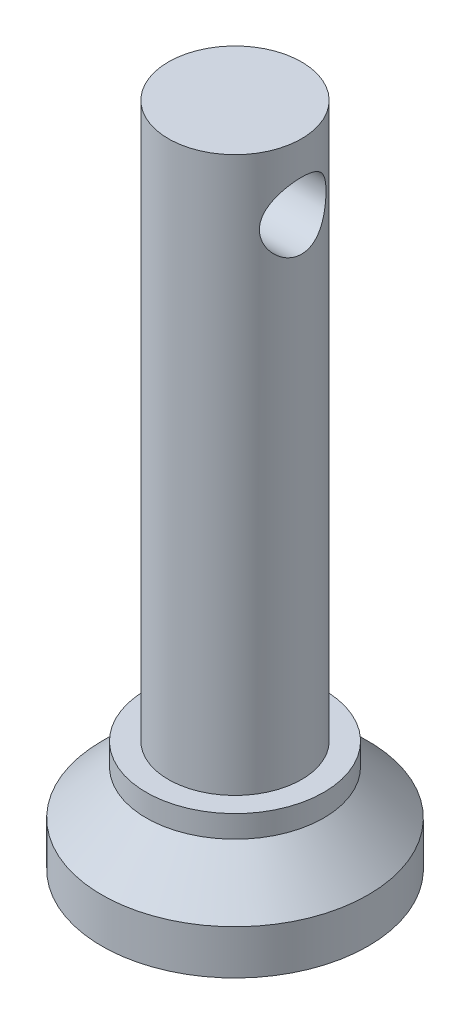
ISO-10303-21;
HEADER;
FILE_DESCRIPTION(('STEP AP214'),'2;1');
FILE_NAME('part.step','',(''),(''),'','','');
FILE_SCHEMA(('AUTOMOTIVE_DESIGN { 1 0 10303 214 1 1 1 1 }'));
ENDSEC;
DATA;
#1=APPLICATION_CONTEXT('core data for automotive mechanical design processes');
#2=APPLICATION_PROTOCOL_DEFINITION('international standard','automotive_design',2000,#1);
#3=PRODUCT_CONTEXT('',#1,'mechanical');
#4=PRODUCT('Part','Part','',(#3));
#5=PRODUCT_RELATED_PRODUCT_CATEGORY('part','',(#4));
#6=PRODUCT_DEFINITION_FORMATION('','',#4);
#7=PRODUCT_DEFINITION_CONTEXT('part definition',#1,'design');
#8=PRODUCT_DEFINITION('design','',#6,#7);
#9=PRODUCT_DEFINITION_SHAPE('','',#8);
#10=(LENGTH_UNIT() NAMED_UNIT(*) SI_UNIT(.MILLI.,.METRE.));
#11=(NAMED_UNIT(*) PLANE_ANGLE_UNIT() SI_UNIT($,.RADIAN.));
#12=(NAMED_UNIT(*) SI_UNIT($,.STERADIAN.) SOLID_ANGLE_UNIT());
#13=UNCERTAINTY_MEASURE_WITH_UNIT(LENGTH_MEASURE(1.E-05),#10,'distance_accuracy_value','');
#14=(GEOMETRIC_REPRESENTATION_CONTEXT(3) GLOBAL_UNCERTAINTY_ASSIGNED_CONTEXT((#13)) GLOBAL_UNIT_ASSIGNED_CONTEXT((#10,
#11,#12)) REPRESENTATION_CONTEXT('',''));
#15=CARTESIAN_POINT('',(0.,0.,0.));
#16=DIRECTION('',(0.,0.,1.));
#17=DIRECTION('',(1.,0.,0.));
#18=AXIS2_PLACEMENT_3D('',#15,#16,#17);
#19=CARTESIAN_POINT('',(0.,30.,0.));
#20=DIRECTION('',(0.,1.,0.));
#21=DIRECTION('',(-1.,0.,0.));
#22=AXIS2_PLACEMENT_3D('',#19,#20,#21);
#23=CYLINDRICAL_SURFACE('',#22,6.);
#24=CARTESIAN_POINT('',(0.,0.,0.));
#25=DIRECTION('',(0.,1.,0.));
#26=DIRECTION('',(-1.,0.,0.));
#27=AXIS2_PLACEMENT_3D('',#24,#25,#26);
#28=CIRCLE('',#27,6.);
#29=CARTESIAN_POINT('',(-5.99999999999997,0.,0.));
#30=VERTEX_POINT('',#29);
#31=EDGE_CURVE('E85',#30,#30,#28,.T.);
#32=ORIENTED_EDGE('',*,*,#31,.T.);
#33=EDGE_LOOP('',(#32));
#34=FACE_BOUND('',#33,.T.);
#35=CARTESIAN_POINT('',(0.,2.,0.));
#36=DIRECTION('',(0.,1.,0.));
#37=DIRECTION('',(-1.,0.,0.));
#38=AXIS2_PLACEMENT_3D('',#35,#36,#37);
#39=CIRCLE('',#38,6.);
#40=CARTESIAN_POINT('',(-5.99999999999997,2.,0.));
#41=VERTEX_POINT('',#40);
#42=EDGE_CURVE('E10',#41,#41,#39,.T.);
#43=ORIENTED_EDGE('',*,*,#42,.F.);
#44=EDGE_LOOP('',(#43));
#45=FACE_BOUND('',#44,.T.);
#46=ADVANCED_FACE('F30',(#34,#45),#23,.T.);
#47=CARTESIAN_POINT('',(0.,4.,0.));
#48=DIRECTION('',(0.,-1.,0.));
#49=DIRECTION('',(1.,0.,0.));
#50=AXIS2_PLACEMENT_3D('',#47,#48,#49);
#51=CONICAL_SURFACE('',#50,3.99999999999999,0.785398163397453);
#52=ORIENTED_EDGE('',*,*,#42,.T.);
#53=EDGE_LOOP('',(#52));
#54=FACE_BOUND('',#53,.T.);
#55=CARTESIAN_POINT('',(0.,4.,0.));
#56=DIRECTION('',(0.,1.,0.));
#57=DIRECTION('',(-1.,0.,0.));
#58=AXIS2_PLACEMENT_3D('',#55,#56,#57);
#59=CIRCLE('',#58,3.99999999999999);
#60=CARTESIAN_POINT('',(-3.99999999999996,4.,0.));
#61=VERTEX_POINT('',#60);
#62=EDGE_CURVE('E41',#61,#61,#59,.T.);
#63=ORIENTED_EDGE('',*,*,#62,.F.);
#64=EDGE_LOOP('',(#63));
#65=FACE_BOUND('',#64,.T.);
#66=ADVANCED_FACE('F76',(#54,#65),#51,.T.);
#67=CARTESIAN_POINT('',(0.,30.,0.));
#68=DIRECTION('',(0.,1.,0.));
#69=DIRECTION('',(-1.,0.,0.));
#70=AXIS2_PLACEMENT_3D('',#67,#68,#69);
#71=CYLINDRICAL_SURFACE('',#70,3.99999999999999);
#72=ORIENTED_EDGE('',*,*,#62,.T.);
#73=EDGE_LOOP('',(#72));
#74=FACE_BOUND('',#73,.T.);
#75=CARTESIAN_POINT('',(0.,5.,0.));
#76=DIRECTION('',(0.,1.,0.));
#77=DIRECTION('',(-1.,0.,0.));
#78=AXIS2_PLACEMENT_3D('',#75,#76,#77);
#79=CIRCLE('',#78,4.);
#80=CARTESIAN_POINT('',(-3.99999999999997,5.,0.));
#81=VERTEX_POINT('',#80);
#82=EDGE_CURVE('E46',#81,#81,#79,.T.);
#83=ORIENTED_EDGE('',*,*,#82,.F.);
#84=EDGE_LOOP('',(#83));
#85=FACE_BOUND('',#84,.T.);
#86=ADVANCED_FACE('F81',(#74,#85),#71,.T.);
#87=CARTESIAN_POINT('',(-3.99999999999998,5.,0.));
#88=DIRECTION('',(0.,1.,0.));
#89=DIRECTION('',(-1.,0.,0.));
#90=AXIS2_PLACEMENT_3D('',#87,#88,#89);
#91=PLANE('',#90);
#92=ORIENTED_EDGE('',*,*,#82,.T.);
#93=EDGE_LOOP('',(#92));
#94=FACE_BOUND('',#93,.T.);
#95=CARTESIAN_POINT('',(0.,5.,0.));
#96=DIRECTION('',(0.,1.,0.));
#97=DIRECTION('',(-1.,0.,0.));
#98=AXIS2_PLACEMENT_3D('',#95,#96,#97);
#99=CIRCLE('',#98,3.);
#100=CARTESIAN_POINT('',(-2.99999999999997,5.,0.));
#101=VERTEX_POINT('',#100);
#102=EDGE_CURVE('E88',#101,#101,#99,.T.);
#103=ORIENTED_EDGE('',*,*,#102,.F.);
#104=EDGE_LOOP('',(#103));
#105=FACE_BOUND('',#104,.T.);
#106=ADVANCED_FACE('F72',(#94,#105),#91,.T.);
#107=CARTESIAN_POINT('',(0.,30.,0.));
#108=DIRECTION('',(0.,1.,0.));
#109=DIRECTION('',(-1.,0.,0.));
#110=AXIS2_PLACEMENT_3D('',#107,#108,#109);
#111=CYLINDRICAL_SURFACE('',#110,3.);
#112=CARTESIAN_POINT('',(-3.00000000000003,25.5,0.));
#113=CARTESIAN_POINT('',(-2.99999570107569,25.5000049534757,0.0788579444267678));
#114=CARTESIAN_POINT('',(-2.99685736529634,25.5062551096816,0.15780989954625));
#115=CARTESIAN_POINT('',(-2.9846123405573,25.5309793205123,0.313380352903241));
#116=CARTESIAN_POINT('',(-2.97549431743376,25.5494765894967,0.389994130070342));
#117=CARTESIAN_POINT('',(-2.9522441910506,25.597790712925,0.53840031732058));
#118=CARTESIAN_POINT('',(-2.93813158766302,25.627563576372,0.610210204408634));
#119=CARTESIAN_POINT('',(-2.90618664773639,25.6973559320475,0.747708925209846));
#120=CARTESIAN_POINT('',(-2.88835460450288,25.7373746163733,0.813398240985063));
#121=CARTESIAN_POINT('',(-2.84934387387096,25.8292758742279,0.941261726642838));
#122=CARTESIAN_POINT('',(-2.82802798691308,25.8817297188594,1.00298281668311));
#123=CARTESIAN_POINT('',(-2.78489955370109,25.9957822188705,1.11716916730027));
#124=CARTESIAN_POINT('',(-2.76308664313538,26.0573877776587,1.16962737465982));
#125=CARTESIAN_POINT('',(-2.71948426796007,26.1937250242851,1.26787800067511));
#126=CARTESIAN_POINT('',(-2.69782780455192,26.2691041475188,1.31283800332731));
#127=CARTESIAN_POINT('',(-2.65928968158482,26.4275510039793,1.38925234033597));
#128=CARTESIAN_POINT('',(-2.64240461410485,26.5106131930841,1.42071632244935));
#129=CARTESIAN_POINT('',(-2.6168680055671,26.6769976581329,1.46719866328271));
#130=CARTESIAN_POINT('',(-2.60778407375565,26.7600066781011,1.48308878562056));
#131=CARTESIAN_POINT('',(-2.59772834922789,26.9279682566692,1.50064048996323));
#132=CARTESIAN_POINT('',(-2.59674854014935,27.0129188113067,1.50231613255956));
#133=CARTESIAN_POINT('',(-2.60266395385876,27.171429036473,1.4920309307584));
#134=CARTESIAN_POINT('',(-2.6086314549302,27.2451360468346,1.48167683930521));
#135=CARTESIAN_POINT('',(-2.62614343100766,27.3895828640596,1.4504097735853));
#136=CARTESIAN_POINT('',(-2.6376896824765,27.460321717958,1.42949343584629));
#137=CARTESIAN_POINT('',(-2.665312146191,27.5988436988485,1.37731467057883));
#138=CARTESIAN_POINT('',(-2.68148760995994,27.6665195981788,1.34582260067393));
#139=CARTESIAN_POINT('',(-2.71655106422103,27.7959514388851,1.27356253150189));
#140=CARTESIAN_POINT('',(-2.73544027170276,27.8577047034001,1.23279036571842));
#141=CARTESIAN_POINT('',(-2.77669736854917,27.9817818791148,1.13709908236885));
#142=CARTESIAN_POINT('',(-2.79920265355115,28.0431853103643,1.08104168755374));
#143=CARTESIAN_POINT('',(-2.84321434950613,28.1561031278865,0.95933336811195));
#144=CARTESIAN_POINT('',(-2.86472027938204,28.2076127880508,0.893677884861245));
#145=CARTESIAN_POINT('',(-2.9055298092445,28.3015284915446,0.750774758747556));
#146=CARTESIAN_POINT('',(-2.92468476243016,28.3434007086687,0.673130387398939));
#147=CARTESIAN_POINT('',(-2.95736821681856,28.4131455435646,0.51069932323301));
#148=CARTESIAN_POINT('',(-2.97090118415309,28.4410292775228,0.425918364397674));
#149=CARTESIAN_POINT('',(-2.98986500612133,28.479713105575,0.259149737490813));
#150=CARTESIAN_POINT('',(-2.99587407451957,28.4917368536202,0.177512295822299));
#151=CARTESIAN_POINT('',(-3.00109520188658,28.5021970967018,0.0131693999239162));
#152=CARTESIAN_POINT('',(-3.00031048081978,28.5006400284592,-0.0695355298049457));
#153=CARTESIAN_POINT('',(-2.99236788380149,28.4846899673719,-0.226849457979044));
#154=CARTESIAN_POINT('',(-2.98570868532248,28.471301200905,-0.301589112074969));
#155=CARTESIAN_POINT('',(-2.96733256972259,28.4336428921573,-0.447610338453021));
#156=CARTESIAN_POINT('',(-2.95561509501621,28.4093721503198,-0.518891528536764));
#157=CARTESIAN_POINT('',(-2.92776377120385,28.3500023003505,-0.6583329126745));
#158=CARTESIAN_POINT('',(-2.91151322654445,28.3146134248256,-0.726345595508827));
#159=CARTESIAN_POINT('',(-2.87615961476121,28.2343386965301,-0.855692042549022));
#160=CARTESIAN_POINT('',(-2.85705533350403,28.1894487981069,-0.917022944665015));
#161=CARTESIAN_POINT('',(-2.81562332004292,28.0863593620039,-1.03765153393394));
#162=CARTESIAN_POINT('',(-2.79316327265243,28.0272856973322,-1.09615811672863));
#163=CARTESIAN_POINT('',(-2.74893587413228,27.9001122730834,-1.20278448167843));
#164=CARTESIAN_POINT('',(-2.72716901100074,27.8320063217281,-1.25089707856804));
#165=CARTESIAN_POINT('',(-2.68576788309738,27.6845345187405,-1.33756187171874));
#166=CARTESIAN_POINT('',(-2.66628794383589,27.6047831008583,-1.37553824370048));
#167=CARTESIAN_POINT('',(-2.63361108441199,27.4387348986375,-1.43712423890212));
#168=CARTESIAN_POINT('',(-2.62040607332628,27.3524467102997,-1.46075237380065));
#169=CARTESIAN_POINT('',(-2.60342251538706,27.1846346656729,-1.49079253120044));
#170=CARTESIAN_POINT('',(-2.59886075197595,27.1034486198471,-1.49863949460827));
#171=CARTESIAN_POINT('',(-2.59748031962404,26.9408293992532,-1.50103373156435));
#172=CARTESIAN_POINT('',(-2.60065829439592,26.8593963468932,-1.49558676993491));
#173=CARTESIAN_POINT('',(-2.61356793076622,26.7067747476998,-1.47288918839));
#174=CARTESIAN_POINT('',(-2.62264641723989,26.6353492947829,-1.45681247151458));
#175=CARTESIAN_POINT('',(-2.64556524281476,26.4962878208634,-1.4147630373367));
#176=CARTESIAN_POINT('',(-2.659407113545,26.4286530268619,-1.38878713674003));
#177=CARTESIAN_POINT('',(-2.69142795546802,26.2940627235202,-1.32572361795099));
#178=CARTESIAN_POINT('',(-2.70983583593878,26.2274581472565,-1.28800670672362));
#179=CARTESIAN_POINT('',(-2.74852997452288,26.1010881957282,-1.2032264574562));
#180=CARTESIAN_POINT('',(-2.76881720693415,26.0413264042183,-1.15615825686256));
#181=CARTESIAN_POINT('',(-2.81193484737135,25.922787026468,-1.04730498999232));
#182=CARTESIAN_POINT('',(-2.83477474959936,25.8650113464746,-0.984426634496045));
#183=CARTESIAN_POINT('',(-2.87816628389894,25.7606055248472,-0.849232209349915));
#184=CARTESIAN_POINT('',(-2.89871667939299,25.7139813907952,-0.776911084957983));
#185=CARTESIAN_POINT('',(-2.93547014349811,25.6331454559319,-0.623897395174636));
#186=CARTESIAN_POINT('',(-2.95164144740894,25.5990237461454,-0.543149255665276));
#187=CARTESIAN_POINT('',(-2.97752011948477,25.5452877483639,-0.376113151707304));
#188=CARTESIAN_POINT('',(-2.98724585044612,25.5256322297914,-0.289841699383855));
#189=CARTESIAN_POINT('',(-2.99543192870219,25.5091538833714,-0.168902919736527));
#190=CARTESIAN_POINT('',(-2.99714048010373,25.5057260387005,-0.135242819162504));
#191=CARTESIAN_POINT('',(-2.9994254546522,25.5011480017289,-0.0677275977077471));
#192=CARTESIAN_POINT('',(-3.00000184655072,25.4999978722947,-0.0338724714700324));
#193=CARTESIAN_POINT('',(-3.00000000000003,25.5,0.));
#194=B_SPLINE_CURVE_WITH_KNOTS('',3,(#112,#113,#114,#115,#116,#117,#118,#119,#120,#121,#122,
#123,#124,#125,#126,#127,#128,#129,#130,#131,#132,#133,#134,#135,#136,#137,#138,#139,#140,#141,
#142,#143,#144,#145,#146,#147,#148,#149,#150,#151,#152,#153,#154,#155,#156,#157,#158,#159,#160,
#161,#162,#163,#164,#165,#166,#167,#168,#169,#170,#171,#172,#173,#174,#175,#176,#177,#178,#179,
#180,#181,#182,#183,#184,#185,#186,#187,#188,#189,#190,#191,#192,#193),.UNSPECIFIED.,.T.,.F.,(4,
2,2,2,2,2,2,2,2,2,2,2,2,2,2,2,2,2,2,2,2,2,2,2,2,2,2,2,2,2,2,2,2,2,2,2,2,2,2,2,4),(0.,
0.236436386130413,0.473322224563767,0.70929323323846,0.945245640872374,1.19547263807706,
1.44588935648093,1.7157258964612,1.98536921847412,2.23887018210336,2.49212035993524,
2.71508568613976,2.93812205888515,3.16635360252732,3.39468781890338,3.65197412000822,
3.90938301898032,4.17874533321665,4.44789325368427,4.69474935707017,4.94148846767202,
5.16910359759175,5.39674382446393,5.63089284041844,5.86514176122506,6.12239415966627,
6.37982382923147,6.64972023242586,6.91926767918172,7.16293961254566,7.40650589797015,
7.62686895373279,7.84730293182519,8.08254685170419,8.31791341715432,8.58187864135744,
8.84598575071855,9.11196020495275,9.37717362931708,9.47872920200866,9.58028757766597),.UNSPECIFIED.);
#195=CARTESIAN_POINT('',(-3.00000000000003,25.5,0.));
#196=VERTEX_POINT('',#195);
#197=EDGE_CURVE('E33',#196,#196,#194,.T.);
#198=ORIENTED_EDGE('',*,*,#197,.F.);
#199=EDGE_LOOP('',(#198));
#200=FACE_BOUND('',#199,.T.);
#201=CARTESIAN_POINT('',(2.59807621135329,27.,-1.50000000000004));
#202=CARTESIAN_POINT('',(2.59808302092683,27.0781617122929,-1.49999454461185));
#203=CARTESIAN_POINT('',(2.60165701781637,27.1564221172876,-1.49384995609988));
#204=CARTESIAN_POINT('',(2.61543549678084,27.3105408970157,-1.46958481484717));
#205=CARTESIAN_POINT('',(2.62565391083339,27.3863938725651,-1.4514390968314));
#206=CARTESIAN_POINT('',(2.65124019908096,27.5331774965159,-1.40414992304987));
#207=CARTESIAN_POINT('',(2.66658065209881,27.6041319787104,-1.37506492874072));
#208=CARTESIAN_POINT('',(2.70063997225289,27.740136302995,-1.30690128806463));
#209=CARTESIAN_POINT('',(2.71935902214095,27.8051858253937,-1.26782210105371));
#210=CARTESIAN_POINT('',(2.7599530358616,27.9334585928362,-1.17699981079637));
#211=CARTESIAN_POINT('',(2.78196095456933,27.9960887035103,-1.12447805421574));
#212=CARTESIAN_POINT('',(2.8255797417856,28.1121125826101,-1.00988071142183));
#213=CARTESIAN_POINT('',(2.84719040746871,28.1655017438753,-0.947800388673586));
#214=CARTESIAN_POINT('',(2.88932215429417,28.2650507267215,-0.81073434512201));
#215=CARTESIAN_POINT('',(2.90967159627258,28.3104806517892,-0.735160783519081));
#216=CARTESIAN_POINT('',(2.94526134149293,28.3877112798686,-0.576235539899558));
#217=CARTESIAN_POINT('',(2.96050486775607,28.4195205842057,-0.49288880720759));
#218=CARTESIAN_POINT('',(2.98320691866351,28.4662569919517,-0.327067415889331));
#219=CARTESIAN_POINT('',(2.99114220331338,28.4822242895333,-0.244952685733543));
#220=CARTESIAN_POINT('',(3.00011375769104,28.5002491780125,-0.0788559430469997));
#221=CARTESIAN_POINT('',(3.00115420176887,28.5023151851935,0.00512490876542022));
#222=CARTESIAN_POINT('',(2.99644472874678,28.4928799890445,0.164748786635468));
#223=CARTESIAN_POINT('',(2.99127743838245,28.4825429767182,0.240481798765021));
#224=CARTESIAN_POINT('',(2.97561367889624,28.4506787341431,0.388970657877259));
#225=CARTESIAN_POINT('',(2.96511681099592,28.4291506665357,0.461726281640617));
#226=CARTESIAN_POINT('',(2.93957374931485,28.3753761508653,0.603464087354074));
#227=CARTESIAN_POINT('',(2.92446662293807,28.342985530242,0.672380135272574));
#228=CARTESIAN_POINT('',(2.89106468980033,28.2686048756979,0.803965202269781));
#229=CARTESIAN_POINT('',(2.87276874236219,28.2266114050465,0.866631973257676));
#230=CARTESIAN_POINT('',(2.83266591598836,28.1296569727005,0.990260491347027));
#231=CARTESIAN_POINT('',(2.81069063997268,28.0738454575111,1.0505011125439));
#232=CARTESIAN_POINT('',(2.76681510880222,27.9531154126048,1.16115655544652));
#233=CARTESIAN_POINT('',(2.74491492398435,27.8881899415889,1.21156381736105));
#234=CARTESIAN_POINT('',(2.70216234138714,27.7460277113639,1.30425800196302));
#235=CARTESIAN_POINT('',(2.68146479986059,27.6682709654187,1.34582597246693));
#236=CARTESIAN_POINT('',(2.64563175417869,27.5055934929616,1.41497866950184));
#237=CARTESIAN_POINT('',(2.63049045069103,27.4206803504737,1.44257798731632));
#238=CARTESIAN_POINT('',(2.60916953725551,27.2531782330758,1.48077031653751));
#239=CARTESIAN_POINT('',(2.60237483772745,27.1709383214347,1.4925376831799));
#240=CARTESIAN_POINT('',(2.59676879042416,27.0053979877252,1.50227541991707));
#241=CARTESIAN_POINT('',(2.59795180333969,26.9220983563203,1.50025553597248));
#242=CARTESIAN_POINT('',(2.60751504810881,26.7665191221319,1.4835540650159));
#243=CARTESIAN_POINT('',(2.61509381259986,26.6940308233381,1.47028172506865));
#244=CARTESIAN_POINT('',(2.63541032327009,26.5524483205936,1.43354442694857));
#245=CARTESIAN_POINT('',(2.64814974007541,26.4833552238801,1.41007616793529));
#246=CARTESIAN_POINT('',(2.67804333119475,26.346883003646,1.3524713829072));
#247=CARTESIAN_POINT('',(2.69537464864594,26.2797314747197,1.317891095539));
#248=CARTESIAN_POINT('',(2.7323417924588,26.1517960926915,1.23943059602361));
#249=CARTESIAN_POINT('',(2.75197880032723,26.0910155347301,1.19554560649818));
#250=CARTESIAN_POINT('',(2.79431997684505,25.9695318487147,1.09325575079811));
#251=CARTESIAN_POINT('',(2.81709874731439,25.9098042739235,1.03371790847232));
#252=CARTESIAN_POINT('',(2.86101352466839,25.8008816430096,0.905106743097353));
#253=CARTESIAN_POINT('',(2.88214897511554,25.7516901446542,0.836030211982944));
#254=CARTESIAN_POINT('',(2.92112042536427,25.6641394110748,0.687803043838063));
#255=CARTESIAN_POINT('',(2.93885462508046,25.6261003226836,0.608434646361093));
#256=CARTESIAN_POINT('',(2.96825032438955,25.5642931442139,0.4432835469615));
#257=CARTESIAN_POINT('',(2.97991715514553,25.5405125229506,0.357506552088098));
#258=CARTESIAN_POINT('',(2.99501262272816,25.509947153738,0.190469523495362));
#259=CARTESIAN_POINT('',(2.99909891862284,25.5018031861859,0.109517165775363));
#260=CARTESIAN_POINT('',(3.00063195562705,25.4987351018184,-0.0526889789272502));
#261=CARTESIAN_POINT('',(2.99808102100348,25.5038063572146,-0.133942650443139));
#262=CARTESIAN_POINT('',(2.98700953256895,25.5261246101934,-0.288806988476185));
#263=CARTESIAN_POINT('',(2.9788934200199,25.5425472738866,-0.362568476717259));
#264=CARTESIAN_POINT('',(2.9578814049513,25.5859904989546,-0.506168928275622));
#265=CARTESIAN_POINT('',(2.94498481699184,25.6130125801402,-0.576007327433393));
#266=CARTESIAN_POINT('',(2.91488896122174,25.678090578249,-0.713135109367401));
#267=CARTESIAN_POINT('',(2.89752925798199,25.7165689848118,-0.780187714050149));
#268=CARTESIAN_POINT('',(2.86032199712745,25.8029368962886,-0.907161962721132));
#269=CARTESIAN_POINT('',(2.84047329837545,25.8508307236735,-0.967080311122467));
#270=CARTESIAN_POINT('',(2.79792915339947,25.960195708534,-1.08437100623543));
#271=CARTESIAN_POINT('',(2.77514698517557,26.0225437312158,-1.14089652680898));
#272=CARTESIAN_POINT('',(2.73094614244279,26.1561760816946,-1.24299493109202));
#273=CARTESIAN_POINT('',(2.70952868642784,26.2274682313015,-1.28855812501506));
#274=CARTESIAN_POINT('',(2.6699940795736,26.3799549698714,-1.36864661967843));
#275=CARTESIAN_POINT('',(2.65200261384405,26.4613912966931,-1.40277759894138));
#276=CARTESIAN_POINT('',(2.62299234492536,26.6299986065097,-1.45631806425978));
#277=CARTESIAN_POINT('',(2.61195024221555,26.717149333369,-1.47577678676337));
#278=CARTESIAN_POINT('',(2.6029390890269,26.837708033478,-1.49155051179681));
#279=CARTESIAN_POINT('',(2.60112193507733,26.8700518415968,-1.49471415744588));
#280=CARTESIAN_POINT('',(2.59868903831628,26.9349247210234,-1.49894010763498));
#281=CARTESIAN_POINT('',(2.59807337587663,26.9674538045788,-1.50000227159985));
#282=CARTESIAN_POINT('',(2.59807621135329,27.,-1.50000000000004));
#283=B_SPLINE_CURVE_WITH_KNOTS('',3,(#201,#202,#203,#204,#205,#206,#207,#208,#209,#210,#211,
#212,#213,#214,#215,#216,#217,#218,#219,#220,#221,#222,#223,#224,#225,#226,#227,#228,#229,#230,
#231,#232,#233,#234,#235,#236,#237,#238,#239,#240,#241,#242,#243,#244,#245,#246,#247,#248,#249,
#250,#251,#252,#253,#254,#255,#256,#257,#258,#259,#260,#261,#262,#263,#264,#265,#266,#267,#268,
#269,#270,#271,#272,#273,#274,#275,#276,#277,#278,#279,#280,#281,#282),.UNSPECIFIED.,.T.,.F.,(4,
2,2,2,2,2,2,2,2,2,2,2,2,2,2,2,2,2,2,2,2,2,2,2,2,2,2,2,2,2,2,2,2,2,2,2,2,2,2,2,4),(0.,
0.234348183892069,0.469189339237161,0.702792893878277,0.936409088167701,1.18929346874731,
1.44230356626548,1.71236838358125,1.98226240445805,2.23295227451885,2.48349035529055,
2.71224146226796,2.94100968776165,3.17294302096704,3.40495949025394,3.65890787185322,
3.91305072368865,4.18333262594166,4.45333161317555,4.70193436281315,4.95036139782557,
5.17161275136035,5.39293578654092,5.62450944609132,5.85620229330076,6.1171011537092,
6.37808797467297,6.64596272119446,6.91360169713164,7.15668405584256,7.39968130190999,
7.62666637307257,7.85368400268018,8.09041126079207,8.32724745151075,8.58765362775092,
8.84828914267722,9.11716123557904,9.38512699504136,9.4827020277796,9.58028358741809),.UNSPECIFIED.);
#284=CARTESIAN_POINT('',(2.59807621135329,27.,-1.50000000000004));
#285=VERTEX_POINT('',#284);
#286=EDGE_CURVE('E49',#285,#285,#283,.T.);
#287=ORIENTED_EDGE('',*,*,#286,.F.);
#288=EDGE_LOOP('',(#287));
#289=FACE_BOUND('',#288,.T.);
#290=ORIENTED_EDGE('',*,*,#102,.T.);
#291=EDGE_LOOP('',(#290));
#292=FACE_BOUND('',#291,.T.);
#293=CARTESIAN_POINT('',(0.,30.,0.));
#294=DIRECTION('',(0.,1.,0.));
#295=DIRECTION('',(-1.,0.,0.));
#296=AXIS2_PLACEMENT_3D('',#293,#294,#295);
#297=CIRCLE('',#296,3.);
#298=CARTESIAN_POINT('',(-2.99999999999997,30.,0.));
#299=VERTEX_POINT('',#298);
#300=EDGE_CURVE('E86',#299,#299,#297,.T.);
#301=ORIENTED_EDGE('',*,*,#300,.F.);
#302=EDGE_LOOP('',(#301));
#303=FACE_BOUND('',#302,.T.);
#304=ADVANCED_FACE('F53',(#200,#289,#292,#303),#111,.T.);
#305=CARTESIAN_POINT('',(-3.00000000000001,30.,0.));
#306=DIRECTION('',(0.,1.,0.));
#307=DIRECTION('',(-1.,0.,0.));
#308=AXIS2_PLACEMENT_3D('',#305,#306,#307);
#309=PLANE('',#308);
#310=ORIENTED_EDGE('',*,*,#300,.T.);
#311=EDGE_LOOP('',(#310));
#312=FACE_BOUND('',#311,.T.);
#313=ADVANCED_FACE('F65',(#312),#309,.T.);
#314=CARTESIAN_POINT('',(0.,0.,0.));
#315=DIRECTION('',(0.,-1.,0.));
#316=DIRECTION('',(1.,0.,0.));
#317=AXIS2_PLACEMENT_3D('',#314,#315,#316);
#318=PLANE('',#317);
#319=ORIENTED_EDGE('',*,*,#31,.F.);
#320=EDGE_LOOP('',(#319));
#321=FACE_BOUND('',#320,.T.);
#322=ADVANCED_FACE('F61',(#321),#318,.T.);
#323=CARTESIAN_POINT('',(-5.99999999999998,27.,0.));
#324=DIRECTION('',(1.,0.,0.));
#325=DIRECTION('',(0.,0.,-1.));
#326=AXIS2_PLACEMENT_3D('',#323,#324,#325);
#327=CYLINDRICAL_SURFACE('',#326,1.5);
#328=ORIENTED_EDGE('',*,*,#197,.T.);
#329=EDGE_LOOP('',(#328));
#330=FACE_BOUND('',#329,.T.);
#331=ORIENTED_EDGE('',*,*,#286,.T.);
#332=EDGE_LOOP('',(#331));
#333=FACE_BOUND('',#332,.T.);
#334=ADVANCED_FACE('F57',(#330,#333),#327,.F.);
#335=CLOSED_SHELL('',(#46,#66,#86,#106,#304,#313,#322,#334));
#336=MANIFOLD_SOLID_BREP('B2',#335);
#337=ADVANCED_BREP_SHAPE_REPRESENTATION('',(#18,#336),#14);
#338=SHAPE_DEFINITION_REPRESENTATION(#9,#337);
ENDSEC;
END-ISO-10303-21;
